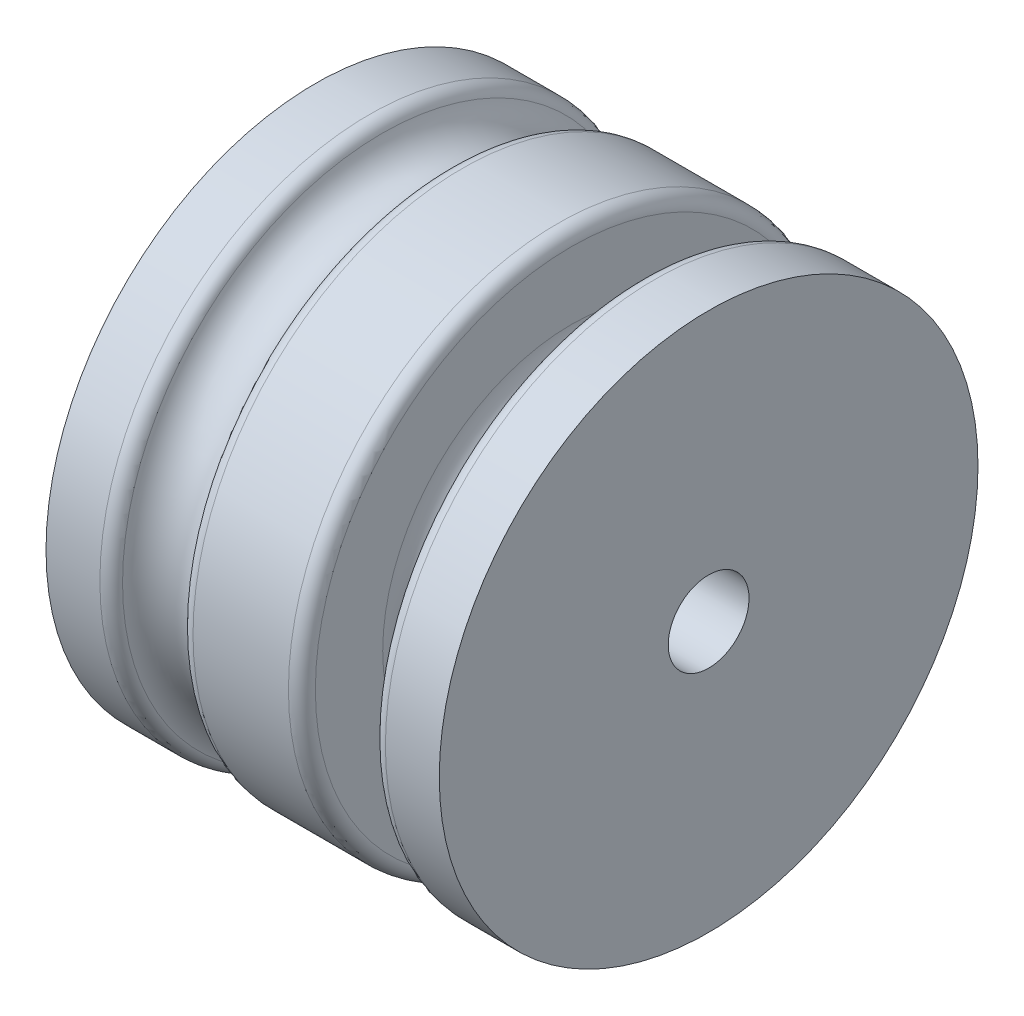
ISO-10303-21;
HEADER;
FILE_DESCRIPTION(('STEP AP214'),'2;1');
FILE_NAME('part.step','',(''),(''),'','','');
FILE_SCHEMA(('AUTOMOTIVE_DESIGN { 1 0 10303 214 1 1 1 1 }'));
ENDSEC;
DATA;
#1=APPLICATION_CONTEXT('core data for automotive mechanical design processes');
#2=APPLICATION_PROTOCOL_DEFINITION('international standard','automotive_design',2000,#1);
#3=PRODUCT_CONTEXT('',#1,'mechanical');
#4=PRODUCT('Part','Part','',(#3));
#5=PRODUCT_RELATED_PRODUCT_CATEGORY('part','',(#4));
#6=PRODUCT_DEFINITION_FORMATION('','',#4);
#7=PRODUCT_DEFINITION_CONTEXT('part definition',#1,'design');
#8=PRODUCT_DEFINITION('design','',#6,#7);
#9=PRODUCT_DEFINITION_SHAPE('','',#8);
#10=(LENGTH_UNIT() NAMED_UNIT(*) SI_UNIT(.MILLI.,.METRE.));
#11=(NAMED_UNIT(*) PLANE_ANGLE_UNIT() SI_UNIT($,.RADIAN.));
#12=(NAMED_UNIT(*) SI_UNIT($,.STERADIAN.) SOLID_ANGLE_UNIT());
#13=UNCERTAINTY_MEASURE_WITH_UNIT(LENGTH_MEASURE(1.E-05),#10,'distance_accuracy_value','');
#14=(GEOMETRIC_REPRESENTATION_CONTEXT(3) GLOBAL_UNCERTAINTY_ASSIGNED_CONTEXT((#13)) GLOBAL_UNIT_ASSIGNED_CONTEXT((#10,
#11,#12)) REPRESENTATION_CONTEXT('',''));
#15=CARTESIAN_POINT('',(0.,0.,0.));
#16=DIRECTION('',(0.,0.,1.));
#17=DIRECTION('',(1.,0.,0.));
#18=AXIS2_PLACEMENT_3D('',#15,#16,#17);
#19=CARTESIAN_POINT('',(-5.6,0.,0.));
#20=DIRECTION('',(-1.,0.,0.));
#21=DIRECTION('',(0.,0.,1.));
#22=AXIS2_PLACEMENT_3D('',#19,#20,#21);
#23=TOROIDAL_SURFACE('',#22,9.5,0.500000000000001);
#24=CARTESIAN_POINT('',(-5.1,0.,0.));
#25=DIRECTION('',(-1.,0.,0.));
#26=DIRECTION('',(0.,0.,1.));
#27=AXIS2_PLACEMENT_3D('',#24,#25,#26);
#28=CIRCLE('',#27,9.5);
#29=CARTESIAN_POINT('',(-5.1,0.,9.5));
#30=VERTEX_POINT('',#29);
#31=EDGE_CURVE('E96',#30,#30,#28,.T.);
#32=ORIENTED_EDGE('',*,*,#31,.T.);
#33=EDGE_LOOP('',(#32));
#34=FACE_BOUND('',#33,.T.);
#35=CARTESIAN_POINT('',(-5.6,0.,0.));
#36=DIRECTION('',(-1.,0.,0.));
#37=DIRECTION('',(0.,0.,1.));
#38=AXIS2_PLACEMENT_3D('',#35,#36,#37);
#39=CIRCLE('',#38,10.);
#40=CARTESIAN_POINT('',(-5.6,0.,10.));
#41=VERTEX_POINT('',#40);
#42=EDGE_CURVE('E10',#41,#41,#39,.T.);
#43=ORIENTED_EDGE('',*,*,#42,.F.);
#44=EDGE_LOOP('',(#43));
#45=FACE_BOUND('',#44,.T.);
#46=ADVANCED_FACE('F45',(#34,#45),#23,.T.);
#47=CARTESIAN_POINT('',(-7.6,0.,0.));
#48=DIRECTION('',(-1.,0.,0.));
#49=DIRECTION('',(0.,0.,1.));
#50=AXIS2_PLACEMENT_3D('',#47,#48,#49);
#51=CYLINDRICAL_SURFACE('',#50,10.);
#52=ORIENTED_EDGE('',*,*,#42,.T.);
#53=EDGE_LOOP('',(#52));
#54=FACE_BOUND('',#53,.T.);
#55=CARTESIAN_POINT('',(-9.14167670684187,0.,0.));
#56=DIRECTION('',(-1.,0.,0.));
#57=DIRECTION('',(0.,0.,1.));
#58=AXIS2_PLACEMENT_3D('',#55,#56,#57);
#59=CIRCLE('',#58,10.);
#60=CARTESIAN_POINT('',(-9.14167670684187,0.,10.));
#61=VERTEX_POINT('',#60);
#62=EDGE_CURVE('E52',#61,#61,#59,.T.);
#63=ORIENTED_EDGE('',*,*,#62,.F.);
#64=EDGE_LOOP('',(#63));
#65=FACE_BOUND('',#64,.T.);
#66=ADVANCED_FACE('F150',(#54,#65),#51,.T.);
#67=CARTESIAN_POINT('',(-9.14167670684187,0.,0.));
#68=DIRECTION('',(-1.,0.,0.));
#69=DIRECTION('',(0.,0.,1.));
#70=AXIS2_PLACEMENT_3D('',#67,#68,#69);
#71=TOROIDAL_SURFACE('',#70,9.5,0.499999999999999);
#72=ORIENTED_EDGE('',*,*,#62,.T.);
#73=EDGE_LOOP('',(#72));
#74=FACE_BOUND('',#73,.T.);
#75=CARTESIAN_POINT('',(-9.62199938644717,0.,0.));
#76=DIRECTION('',(-1.,0.,0.));
#77=DIRECTION('',(0.,0.,1.));
#78=AXIS2_PLACEMENT_3D('',#75,#76,#77);
#79=CIRCLE('',#78,9.63888888888889);
#80=CARTESIAN_POINT('',(-9.62199938644717,0.,9.63888888888889));
#81=VERTEX_POINT('',#80);
#82=EDGE_CURVE('E57',#81,#81,#79,.T.);
#83=ORIENTED_EDGE('',*,*,#82,.F.);
#84=EDGE_LOOP('',(#83));
#85=FACE_BOUND('',#84,.T.);
#86=ADVANCED_FACE('F154',(#74,#85),#71,.T.);
#87=CARTESIAN_POINT('',(-10.8708383534209,0.,0.));
#88=DIRECTION('',(-1.,0.,0.));
#89=DIRECTION('',(0.,0.,1.));
#90=AXIS2_PLACEMENT_3D('',#87,#88,#89);
#91=TOROIDAL_SURFACE('',#90,10.,1.3);
#92=ORIENTED_EDGE('',*,*,#82,.T.);
#93=EDGE_LOOP('',(#92));
#94=FACE_BOUND('',#93,.T.);
#95=CARTESIAN_POINT('',(-12.1196773203947,0.,0.));
#96=DIRECTION('',(-1.,0.,0.));
#97=DIRECTION('',(0.,0.,1.));
#98=AXIS2_PLACEMENT_3D('',#95,#96,#97);
#99=CIRCLE('',#98,9.63888888888889);
#100=CARTESIAN_POINT('',(-12.1196773203947,0.,9.63888888888889));
#101=VERTEX_POINT('',#100);
#102=EDGE_CURVE('E62',#101,#101,#99,.T.);
#103=ORIENTED_EDGE('',*,*,#102,.F.);
#104=EDGE_LOOP('',(#103));
#105=FACE_BOUND('',#104,.T.);
#106=ADVANCED_FACE('F158',(#94,#105),#91,.F.);
#107=CARTESIAN_POINT('',(-12.6,0.,0.));
#108=DIRECTION('',(-1.,0.,0.));
#109=DIRECTION('',(0.,0.,1.));
#110=AXIS2_PLACEMENT_3D('',#107,#108,#109);
#111=TOROIDAL_SURFACE('',#110,9.5,0.499999999999999);
#112=ORIENTED_EDGE('',*,*,#102,.T.);
#113=EDGE_LOOP('',(#112));
#114=FACE_BOUND('',#113,.T.);
#115=CARTESIAN_POINT('',(-12.6,0.,0.));
#116=DIRECTION('',(-1.,0.,0.));
#117=DIRECTION('',(0.,0.,1.));
#118=AXIS2_PLACEMENT_3D('',#115,#116,#117);
#119=CIRCLE('',#118,10.);
#120=CARTESIAN_POINT('',(-12.6,0.,10.));
#121=VERTEX_POINT('',#120);
#122=EDGE_CURVE('E68',#121,#121,#119,.T.);
#123=ORIENTED_EDGE('',*,*,#122,.F.);
#124=EDGE_LOOP('',(#123));
#125=FACE_BOUND('',#124,.T.);
#126=ADVANCED_FACE('F164',(#114,#125),#111,.T.);
#127=CARTESIAN_POINT('',(-7.6,0.,0.));
#128=DIRECTION('',(-1.,0.,0.));
#129=DIRECTION('',(0.,0.,1.));
#130=AXIS2_PLACEMENT_3D('',#127,#128,#129);
#131=CYLINDRICAL_SURFACE('',#130,10.);
#132=ORIENTED_EDGE('',*,*,#122,.T.);
#133=EDGE_LOOP('',(#132));
#134=FACE_BOUND('',#133,.T.);
#135=CARTESIAN_POINT('',(-14.6,0.,0.));
#136=DIRECTION('',(-1.,0.,0.));
#137=DIRECTION('',(0.,0.,1.));
#138=AXIS2_PLACEMENT_3D('',#135,#136,#137);
#139=CIRCLE('',#138,10.);
#140=CARTESIAN_POINT('',(-14.6,0.,10.));
#141=VERTEX_POINT('',#140);
#142=EDGE_CURVE('E72',#141,#141,#139,.T.);
#143=ORIENTED_EDGE('',*,*,#142,.F.);
#144=EDGE_LOOP('',(#143));
#145=FACE_BOUND('',#144,.T.);
#146=ADVANCED_FACE('F168',(#134,#145),#131,.T.);
#147=CARTESIAN_POINT('',(-14.6,0.,0.));
#148=DIRECTION('',(-1.,0.,0.));
#149=DIRECTION('',(0.,0.,1.));
#150=AXIS2_PLACEMENT_3D('',#147,#148,#149);
#151=PLANE('',#150);
#152=CARTESIAN_POINT('',(-14.6,0.,0.));
#153=DIRECTION('',(-1.,0.,0.));
#154=DIRECTION('',(0.,0.,1.));
#155=AXIS2_PLACEMENT_3D('',#152,#153,#154);
#156=CIRCLE('',#155,1.5);
#157=CARTESIAN_POINT('',(-14.6,0.,1.5));
#158=VERTEX_POINT('',#157);
#159=EDGE_CURVE('E100',#158,#158,#156,.T.);
#160=ORIENTED_EDGE('',*,*,#159,.F.);
#161=EDGE_LOOP('',(#160));
#162=FACE_BOUND('',#161,.T.);
#163=ORIENTED_EDGE('',*,*,#142,.T.);
#164=EDGE_LOOP('',(#163));
#165=FACE_BOUND('',#164,.T.);
#166=ADVANCED_FACE('F115',(#162,#165),#151,.T.);
#167=CARTESIAN_POINT('',(0.,0.,0.));
#168=DIRECTION('',(1.,0.,0.));
#169=DIRECTION('',(0.,0.,-1.));
#170=AXIS2_PLACEMENT_3D('',#167,#168,#169);
#171=PLANE('',#170);
#172=CARTESIAN_POINT('',(0.,0.,0.));
#173=DIRECTION('',(1.,0.,0.));
#174=DIRECTION('',(0.,1.,0.));
#175=AXIS2_PLACEMENT_3D('',#172,#173,#174);
#176=CIRCLE('',#175,1.5);
#177=CARTESIAN_POINT('',(0.,1.5,0.));
#178=VERTEX_POINT('',#177);
#179=EDGE_CURVE('E104',#178,#178,#176,.T.);
#180=ORIENTED_EDGE('',*,*,#179,.F.);
#181=EDGE_LOOP('',(#180));
#182=FACE_BOUND('',#181,.T.);
#183=CARTESIAN_POINT('',(0.,0.,0.));
#184=DIRECTION('',(-1.,0.,0.));
#185=DIRECTION('',(0.,0.,1.));
#186=AXIS2_PLACEMENT_3D('',#183,#184,#185);
#187=CIRCLE('',#186,10.);
#188=CARTESIAN_POINT('',(0.,0.,10.));
#189=VERTEX_POINT('',#188);
#190=EDGE_CURVE('E76',#189,#189,#187,.T.);
#191=ORIENTED_EDGE('',*,*,#190,.F.);
#192=EDGE_LOOP('',(#191));
#193=FACE_BOUND('',#192,.T.);
#194=ADVANCED_FACE('F111',(#182,#193),#171,.T.);
#195=CARTESIAN_POINT('',(-7.6,0.,0.));
#196=DIRECTION('',(-1.,0.,0.));
#197=DIRECTION('',(0.,0.,1.));
#198=AXIS2_PLACEMENT_3D('',#195,#196,#197);
#199=CYLINDRICAL_SURFACE('',#198,10.);
#200=ORIENTED_EDGE('',*,*,#190,.T.);
#201=EDGE_LOOP('',(#200));
#202=FACE_BOUND('',#201,.T.);
#203=CARTESIAN_POINT('',(-2.,0.,0.));
#204=DIRECTION('',(-1.,0.,0.));
#205=DIRECTION('',(0.,0.,1.));
#206=AXIS2_PLACEMENT_3D('',#203,#204,#205);
#207=CIRCLE('',#206,10.);
#208=CARTESIAN_POINT('',(-2.,0.,10.));
#209=VERTEX_POINT('',#208);
#210=EDGE_CURVE('E80',#209,#209,#207,.T.);
#211=ORIENTED_EDGE('',*,*,#210,.F.);
#212=EDGE_LOOP('',(#211));
#213=FACE_BOUND('',#212,.T.);
#214=ADVANCED_FACE('F114',(#202,#213),#199,.T.);
#215=CARTESIAN_POINT('',(-2.,0.,0.));
#216=DIRECTION('',(-1.,0.,0.));
#217=DIRECTION('',(0.,0.,1.));
#218=AXIS2_PLACEMENT_3D('',#215,#216,#217);
#219=TOROIDAL_SURFACE('',#218,9.5,0.500000000000001);
#220=ORIENTED_EDGE('',*,*,#210,.T.);
#221=EDGE_LOOP('',(#220));
#222=FACE_BOUND('',#221,.T.);
#223=CARTESIAN_POINT('',(-2.5,0.,0.));
#224=DIRECTION('',(-1.,0.,0.));
#225=DIRECTION('',(0.,0.,1.));
#226=AXIS2_PLACEMENT_3D('',#223,#224,#225);
#227=CIRCLE('',#226,9.5);
#228=CARTESIAN_POINT('',(-2.5,0.,9.5));
#229=VERTEX_POINT('',#228);
#230=EDGE_CURVE('E84',#229,#229,#227,.T.);
#231=ORIENTED_EDGE('',*,*,#230,.F.);
#232=EDGE_LOOP('',(#231));
#233=FACE_BOUND('',#232,.T.);
#234=ADVANCED_FACE('F121',(#222,#233),#219,.T.);
#235=CARTESIAN_POINT('',(-2.5,0.,0.));
#236=DIRECTION('',(-1.,0.,0.));
#237=DIRECTION('',(0.,0.,1.));
#238=AXIS2_PLACEMENT_3D('',#235,#236,#237);
#239=PLANE('',#238);
#240=ORIENTED_EDGE('',*,*,#230,.T.);
#241=EDGE_LOOP('',(#240));
#242=FACE_BOUND('',#241,.T.);
#243=CARTESIAN_POINT('',(-2.5,0.,0.));
#244=DIRECTION('',(-1.,0.,0.));
#245=DIRECTION('',(0.,0.,1.));
#246=AXIS2_PLACEMENT_3D('',#243,#244,#245);
#247=CIRCLE('',#246,7.);
#248=CARTESIAN_POINT('',(-2.5,0.,7.));
#249=VERTEX_POINT('',#248);
#250=EDGE_CURVE('E88',#249,#249,#247,.T.);
#251=ORIENTED_EDGE('',*,*,#250,.F.);
#252=EDGE_LOOP('',(#251));
#253=FACE_BOUND('',#252,.T.);
#254=ADVANCED_FACE('F127',(#242,#253),#239,.T.);
#255=CARTESIAN_POINT('',(-3.8,0.,0.));
#256=DIRECTION('',(-1.,0.,0.));
#257=DIRECTION('',(0.,0.,1.));
#258=AXIS2_PLACEMENT_3D('',#255,#256,#257);
#259=TOROIDAL_SURFACE('',#258,7.,1.3);
#260=ORIENTED_EDGE('',*,*,#250,.T.);
#261=EDGE_LOOP('',(#260));
#262=FACE_BOUND('',#261,.T.);
#263=CARTESIAN_POINT('',(-5.1,0.,0.));
#264=DIRECTION('',(-1.,0.,0.));
#265=DIRECTION('',(0.,0.,1.));
#266=AXIS2_PLACEMENT_3D('',#263,#264,#265);
#267=CIRCLE('',#266,7.);
#268=CARTESIAN_POINT('',(-5.1,0.,7.));
#269=VERTEX_POINT('',#268);
#270=EDGE_CURVE('E92',#269,#269,#267,.T.);
#271=ORIENTED_EDGE('',*,*,#270,.F.);
#272=EDGE_LOOP('',(#271));
#273=FACE_BOUND('',#272,.T.);
#274=ADVANCED_FACE('F133',(#262,#273),#259,.F.);
#275=CARTESIAN_POINT('',(-5.1,0.,0.));
#276=DIRECTION('',(1.,0.,0.));
#277=DIRECTION('',(0.,0.,-1.));
#278=AXIS2_PLACEMENT_3D('',#275,#276,#277);
#279=PLANE('',#278);
#280=ORIENTED_EDGE('',*,*,#270,.T.);
#281=EDGE_LOOP('',(#280));
#282=FACE_BOUND('',#281,.T.);
#283=ORIENTED_EDGE('',*,*,#31,.F.);
#284=EDGE_LOOP('',(#283));
#285=FACE_BOUND('',#284,.T.);
#286=ADVANCED_FACE('F139',(#282,#285),#279,.T.);
#287=CARTESIAN_POINT('',(-20.,0.,0.));
#288=DIRECTION('',(1.,0.,0.));
#289=DIRECTION('',(0.,1.,0.));
#290=AXIS2_PLACEMENT_3D('',#287,#288,#289);
#291=CYLINDRICAL_SURFACE('',#290,1.5);
#292=ORIENTED_EDGE('',*,*,#159,.T.);
#293=EDGE_LOOP('',(#292));
#294=FACE_BOUND('',#293,.T.);
#295=ORIENTED_EDGE('',*,*,#179,.T.);
#296=EDGE_LOOP('',(#295));
#297=FACE_BOUND('',#296,.T.);
#298=ADVANCED_FACE('F109',(#294,#297),#291,.F.);
#299=CLOSED_SHELL('',(#46,#66,#86,#106,#126,#146,#166,#194,#214,#234,#254,#274,#286,#298));
#300=MANIFOLD_SOLID_BREP('B2',#299);
#301=ADVANCED_BREP_SHAPE_REPRESENTATION('',(#18,#300),#14);
#302=SHAPE_DEFINITION_REPRESENTATION(#9,#301);
ENDSEC;
END-ISO-10303-21;
